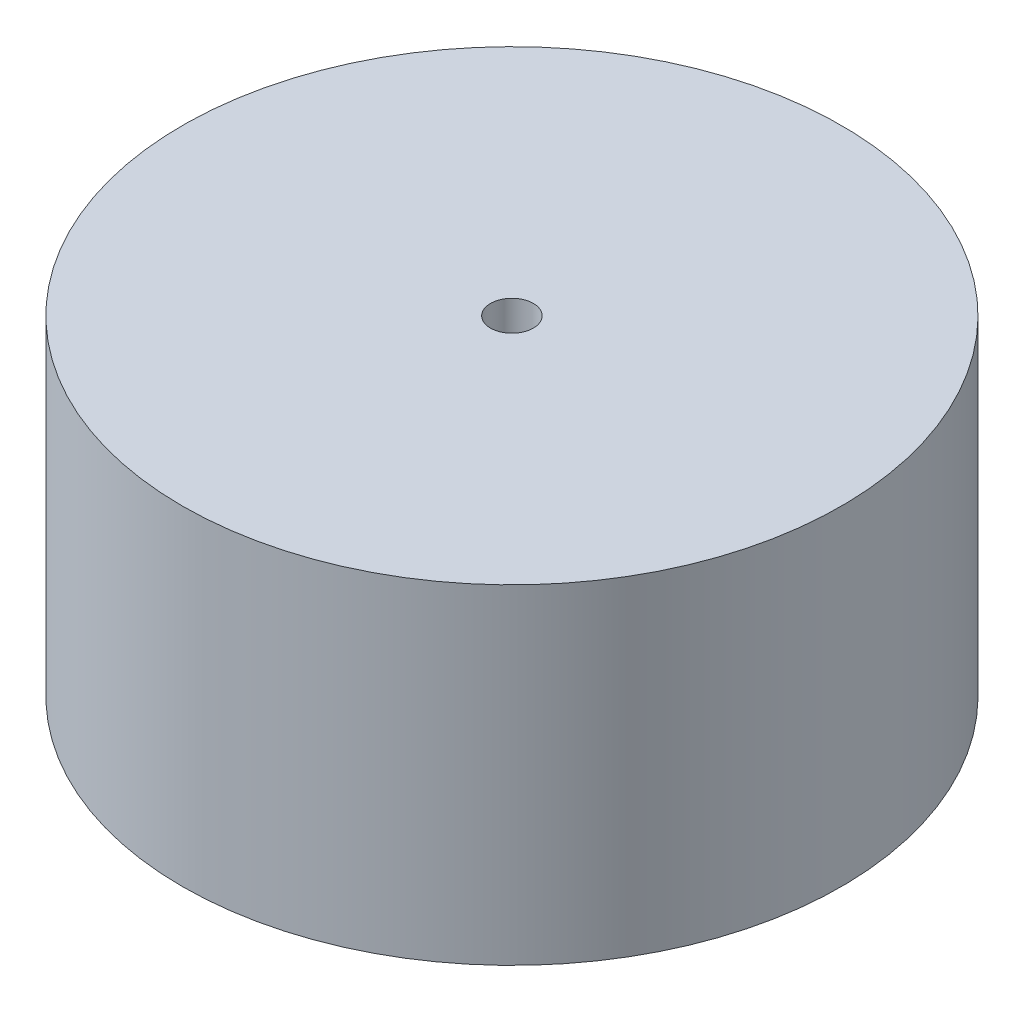
ISO-10303-21;
HEADER;
FILE_DESCRIPTION(('STEP AP214'),'2;1');
FILE_NAME('part.step','',(''),(''),'','','');
FILE_SCHEMA(('AUTOMOTIVE_DESIGN { 1 0 10303 214 1 1 1 1 }'));
ENDSEC;
DATA;
#1=APPLICATION_CONTEXT('core data for automotive mechanical design processes');
#2=APPLICATION_PROTOCOL_DEFINITION('international standard','automotive_design',2000,#1);
#3=PRODUCT_CONTEXT('',#1,'mechanical');
#4=PRODUCT('Part','Part','',(#3));
#5=PRODUCT_RELATED_PRODUCT_CATEGORY('part','',(#4));
#6=PRODUCT_DEFINITION_FORMATION('','',#4);
#7=PRODUCT_DEFINITION_CONTEXT('part definition',#1,'design');
#8=PRODUCT_DEFINITION('design','',#6,#7);
#9=PRODUCT_DEFINITION_SHAPE('','',#8);
#10=(LENGTH_UNIT() NAMED_UNIT(*) SI_UNIT(.MILLI.,.METRE.));
#11=(NAMED_UNIT(*) PLANE_ANGLE_UNIT() SI_UNIT($,.RADIAN.));
#12=(NAMED_UNIT(*) SI_UNIT($,.STERADIAN.) SOLID_ANGLE_UNIT());
#13=UNCERTAINTY_MEASURE_WITH_UNIT(LENGTH_MEASURE(1.E-05),#10,'distance_accuracy_value','');
#14=(GEOMETRIC_REPRESENTATION_CONTEXT(3) GLOBAL_UNCERTAINTY_ASSIGNED_CONTEXT((#13)) GLOBAL_UNIT_ASSIGNED_CONTEXT((#10,
#11,#12)) REPRESENTATION_CONTEXT('',''));
#15=CARTESIAN_POINT('',(0.,0.,0.));
#16=DIRECTION('',(0.,0.,1.));
#17=DIRECTION('',(1.,0.,0.));
#18=AXIS2_PLACEMENT_3D('',#15,#16,#17);
#19=CARTESIAN_POINT('',(0.,10.,0.));
#20=DIRECTION('',(0.,-1.,0.));
#21=DIRECTION('',(0.,0.,-1.));
#22=AXIS2_PLACEMENT_3D('',#19,#20,#21);
#23=CYLINDRICAL_SURFACE('',#22,10.);
#24=CARTESIAN_POINT('',(0.,10.,0.));
#25=DIRECTION('',(0.,1.,0.));
#26=DIRECTION('',(0.,0.,1.));
#27=AXIS2_PLACEMENT_3D('',#24,#25,#26);
#28=CIRCLE('',#27,10.);
#29=CARTESIAN_POINT('',(0.,10.,10.));
#30=VERTEX_POINT('',#29);
#31=EDGE_CURVE('E10',#30,#30,#28,.T.);
#32=ORIENTED_EDGE('',*,*,#31,.F.);
#33=EDGE_LOOP('',(#32));
#34=FACE_BOUND('',#33,.T.);
#35=CARTESIAN_POINT('',(0.,0.,0.));
#36=DIRECTION('',(0.,1.,0.));
#37=DIRECTION('',(0.,0.,1.));
#38=AXIS2_PLACEMENT_3D('',#35,#36,#37);
#39=CIRCLE('',#38,10.);
#40=CARTESIAN_POINT('',(0.,0.,10.));
#41=VERTEX_POINT('',#40);
#42=EDGE_CURVE('E42',#41,#41,#39,.T.);
#43=ORIENTED_EDGE('',*,*,#42,.T.);
#44=EDGE_LOOP('',(#43));
#45=FACE_BOUND('',#44,.T.);
#46=ADVANCED_FACE('F39',(#34,#45),#23,.T.);
#47=CARTESIAN_POINT('',(0.,10.,0.));
#48=DIRECTION('',(0.,1.,0.));
#49=DIRECTION('',(0.,0.,1.));
#50=AXIS2_PLACEMENT_3D('',#47,#48,#49);
#51=PLANE('',#50);
#52=CARTESIAN_POINT('',(0.,10.,0.));
#53=DIRECTION('',(0.,1.,0.));
#54=DIRECTION('',(0.,0.,1.));
#55=AXIS2_PLACEMENT_3D('',#52,#53,#54);
#56=CIRCLE('',#55,0.65);
#57=CARTESIAN_POINT('',(0.,10.,0.65));
#58=VERTEX_POINT('',#57);
#59=EDGE_CURVE('E51',#58,#58,#56,.T.);
#60=ORIENTED_EDGE('',*,*,#59,.F.);
#61=EDGE_LOOP('',(#60));
#62=FACE_BOUND('',#61,.T.);
#63=ORIENTED_EDGE('',*,*,#31,.T.);
#64=EDGE_LOOP('',(#63));
#65=FACE_BOUND('',#64,.T.);
#66=ADVANCED_FACE('F66',(#62,#65),#51,.T.);
#67=CARTESIAN_POINT('',(0.,0.,0.));
#68=DIRECTION('',(0.,1.,0.));
#69=DIRECTION('',(0.,0.,1.));
#70=AXIS2_PLACEMENT_3D('',#67,#68,#69);
#71=PLANE('',#70);
#72=CARTESIAN_POINT('',(0.,0.,0.));
#73=DIRECTION('',(0.,1.,0.));
#74=DIRECTION('',(0.,0.,1.));
#75=AXIS2_PLACEMENT_3D('',#72,#73,#74);
#76=CIRCLE('',#75,0.65);
#77=CARTESIAN_POINT('',(0.,0.,0.65));
#78=VERTEX_POINT('',#77);
#79=EDGE_CURVE('E49',#78,#78,#76,.T.);
#80=ORIENTED_EDGE('',*,*,#79,.T.);
#81=EDGE_LOOP('',(#80));
#82=FACE_BOUND('',#81,.T.);
#83=ORIENTED_EDGE('',*,*,#42,.F.);
#84=EDGE_LOOP('',(#83));
#85=FACE_BOUND('',#84,.T.);
#86=ADVANCED_FACE('F57',(#82,#85),#71,.F.);
#87=CARTESIAN_POINT('',(0.,0.,0.));
#88=DIRECTION('',(0.,1.,0.));
#89=DIRECTION('',(0.,0.,1.));
#90=AXIS2_PLACEMENT_3D('',#87,#88,#89);
#91=CYLINDRICAL_SURFACE('',#90,0.65);
#92=ORIENTED_EDGE('',*,*,#79,.F.);
#93=EDGE_LOOP('',(#92));
#94=FACE_BOUND('',#93,.T.);
#95=ORIENTED_EDGE('',*,*,#59,.T.);
#96=EDGE_LOOP('',(#95));
#97=FACE_BOUND('',#96,.T.);
#98=ADVANCED_FACE('F60',(#94,#97),#91,.F.);
#99=CLOSED_SHELL('',(#46,#66,#86,#98));
#100=MANIFOLD_SOLID_BREP('B2',#99);
#101=ADVANCED_BREP_SHAPE_REPRESENTATION('',(#18,#100),#14);
#102=SHAPE_DEFINITION_REPRESENTATION(#9,#101);
ENDSEC;
END-ISO-10303-21;
